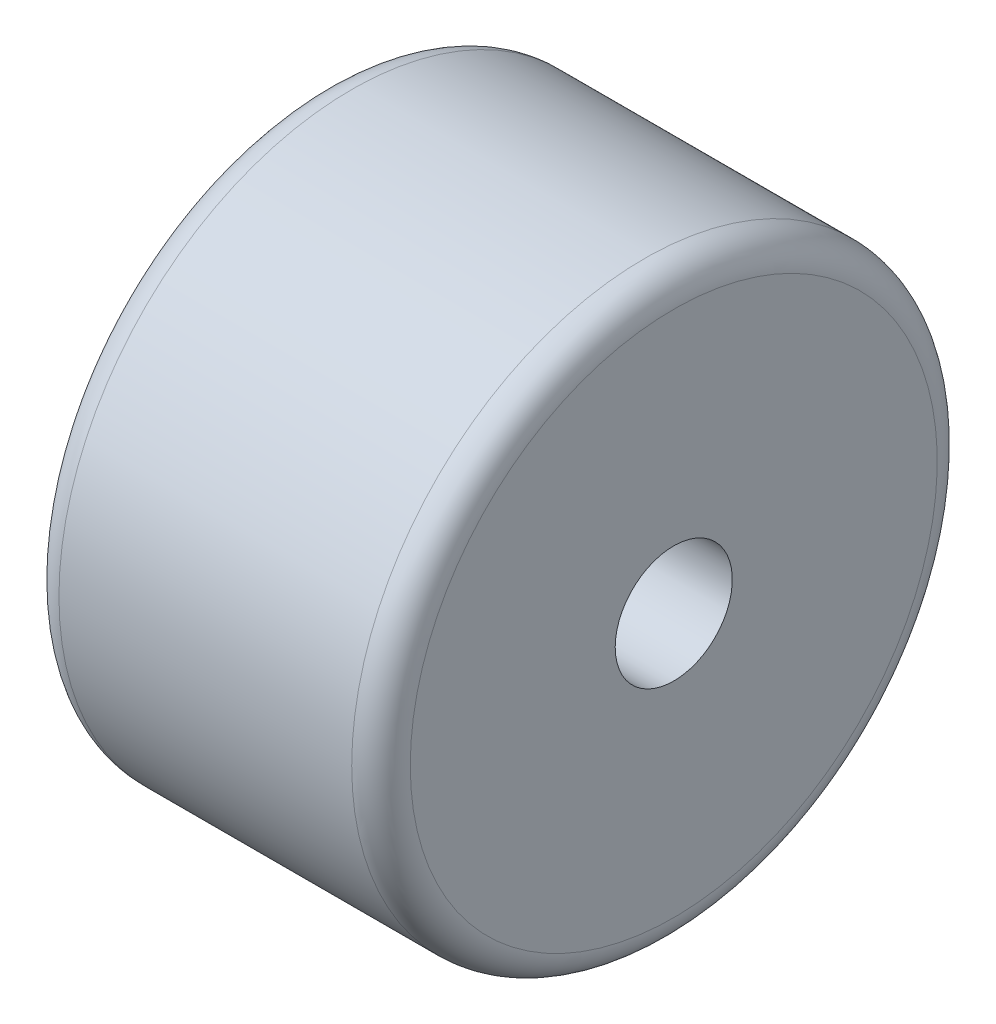
ISO-10303-21;
HEADER;
FILE_DESCRIPTION(('STEP AP214'),'2;1');
FILE_NAME('part.step','',(''),(''),'','','');
FILE_SCHEMA(('AUTOMOTIVE_DESIGN { 1 0 10303 214 1 1 1 1 }'));
ENDSEC;
DATA;
#1=APPLICATION_CONTEXT('core data for automotive mechanical design processes');
#2=APPLICATION_PROTOCOL_DEFINITION('international standard','automotive_design',2000,#1);
#3=PRODUCT_CONTEXT('',#1,'mechanical');
#4=PRODUCT('Part','Part','',(#3));
#5=PRODUCT_RELATED_PRODUCT_CATEGORY('part','',(#4));
#6=PRODUCT_DEFINITION_FORMATION('','',#4);
#7=PRODUCT_DEFINITION_CONTEXT('part definition',#1,'design');
#8=PRODUCT_DEFINITION('design','',#6,#7);
#9=PRODUCT_DEFINITION_SHAPE('','',#8);
#10=(LENGTH_UNIT() NAMED_UNIT(*) SI_UNIT(.MILLI.,.METRE.));
#11=(NAMED_UNIT(*) PLANE_ANGLE_UNIT() SI_UNIT($,.RADIAN.));
#12=(NAMED_UNIT(*) SI_UNIT($,.STERADIAN.) SOLID_ANGLE_UNIT());
#13=UNCERTAINTY_MEASURE_WITH_UNIT(LENGTH_MEASURE(1.E-05),#10,'distance_accuracy_value','');
#14=(GEOMETRIC_REPRESENTATION_CONTEXT(3) GLOBAL_UNCERTAINTY_ASSIGNED_CONTEXT((#13)) GLOBAL_UNIT_ASSIGNED_CONTEXT((#10,
#11,#12)) REPRESENTATION_CONTEXT('',''));
#15=CARTESIAN_POINT('',(0.,0.,0.));
#16=DIRECTION('',(0.,0.,1.));
#17=DIRECTION('',(1.,0.,0.));
#18=AXIS2_PLACEMENT_3D('',#15,#16,#17);
#19=CARTESIAN_POINT('',(0.,0.,0.));
#20=DIRECTION('',(-1.,0.,0.));
#21=DIRECTION('',(0.,0.,1.));
#22=AXIS2_PLACEMENT_3D('',#19,#20,#21);
#23=CYLINDRICAL_SURFACE('',#22,10.);
#24=CARTESIAN_POINT('',(1.,0.,0.));
#25=DIRECTION('',(-1.,0.,0.));
#26=DIRECTION('',(0.,0.,1.));
#27=AXIS2_PLACEMENT_3D('',#24,#25,#26);
#28=CIRCLE('',#27,10.);
#29=CARTESIAN_POINT('',(1.,0.,10.));
#30=VERTEX_POINT('',#29);
#31=EDGE_CURVE('E10',#30,#30,#28,.T.);
#32=ORIENTED_EDGE('',*,*,#31,.F.);
#33=EDGE_LOOP('',(#32));
#34=FACE_BOUND('',#33,.T.);
#35=CARTESIAN_POINT('',(11.,0.,0.));
#36=DIRECTION('',(-1.,0.,0.));
#37=DIRECTION('',(0.,0.,1.));
#38=AXIS2_PLACEMENT_3D('',#35,#36,#37);
#39=CIRCLE('',#38,10.);
#40=CARTESIAN_POINT('',(11.,0.,10.));
#41=VERTEX_POINT('',#40);
#42=EDGE_CURVE('E61',#41,#41,#39,.T.);
#43=ORIENTED_EDGE('',*,*,#42,.T.);
#44=EDGE_LOOP('',(#43));
#45=FACE_BOUND('',#44,.T.);
#46=ADVANCED_FACE('F39',(#34,#45),#23,.T.);
#47=CARTESIAN_POINT('',(1.,0.,0.));
#48=DIRECTION('',(-1.,0.,0.));
#49=DIRECTION('',(0.,0.,1.));
#50=AXIS2_PLACEMENT_3D('',#47,#48,#49);
#51=TOROIDAL_SURFACE('',#50,9.,1.);
#52=CARTESIAN_POINT('',(0.,0.,0.));
#53=DIRECTION('',(-1.,0.,0.));
#54=DIRECTION('',(0.,0.,1.));
#55=AXIS2_PLACEMENT_3D('',#52,#53,#54);
#56=CIRCLE('',#55,9.);
#57=CARTESIAN_POINT('',(0.,0.,9.));
#58=VERTEX_POINT('',#57);
#59=EDGE_CURVE('E45',#58,#58,#56,.T.);
#60=ORIENTED_EDGE('',*,*,#59,.F.);
#61=EDGE_LOOP('',(#60));
#62=FACE_BOUND('',#61,.T.);
#63=ORIENTED_EDGE('',*,*,#31,.T.);
#64=EDGE_LOOP('',(#63));
#65=FACE_BOUND('',#64,.T.);
#66=ADVANCED_FACE('F86',(#62,#65),#51,.T.);
#67=CARTESIAN_POINT('',(0.,0.,0.));
#68=DIRECTION('',(1.,0.,0.));
#69=DIRECTION('',(0.,0.,-1.));
#70=AXIS2_PLACEMENT_3D('',#67,#68,#69);
#71=PLANE('',#70);
#72=CARTESIAN_POINT('',(0.,0.,0.));
#73=DIRECTION('',(-1.,0.,0.));
#74=DIRECTION('',(0.,0.,1.));
#75=AXIS2_PLACEMENT_3D('',#72,#73,#74);
#76=CIRCLE('',#75,2.);
#77=CARTESIAN_POINT('',(0.,0.,2.));
#78=VERTEX_POINT('',#77);
#79=EDGE_CURVE('E49',#78,#78,#76,.T.);
#80=ORIENTED_EDGE('',*,*,#79,.F.);
#81=EDGE_LOOP('',(#80));
#82=FACE_BOUND('',#81,.T.);
#83=ORIENTED_EDGE('',*,*,#59,.T.);
#84=EDGE_LOOP('',(#83));
#85=FACE_BOUND('',#84,.T.);
#86=ADVANCED_FACE('F81',(#82,#85),#71,.F.);
#87=CARTESIAN_POINT('',(0.,0.,0.));
#88=DIRECTION('',(-1.,0.,0.));
#89=DIRECTION('',(0.,0.,1.));
#90=AXIS2_PLACEMENT_3D('',#87,#88,#89);
#91=CYLINDRICAL_SURFACE('',#90,2.);
#92=CARTESIAN_POINT('',(12.,0.,0.));
#93=DIRECTION('',(-1.,0.,0.));
#94=DIRECTION('',(0.,0.,1.));
#95=AXIS2_PLACEMENT_3D('',#92,#93,#94);
#96=CIRCLE('',#95,2.);
#97=CARTESIAN_POINT('',(12.,0.,2.));
#98=VERTEX_POINT('',#97);
#99=EDGE_CURVE('E53',#98,#98,#96,.T.);
#100=ORIENTED_EDGE('',*,*,#99,.F.);
#101=EDGE_LOOP('',(#100));
#102=FACE_BOUND('',#101,.T.);
#103=ORIENTED_EDGE('',*,*,#79,.T.);
#104=EDGE_LOOP('',(#103));
#105=FACE_BOUND('',#104,.T.);
#106=ADVANCED_FACE('F75',(#102,#105),#91,.F.);
#107=CARTESIAN_POINT('',(12.,0.,0.));
#108=DIRECTION('',(-1.,0.,0.));
#109=DIRECTION('',(0.,0.,1.));
#110=AXIS2_PLACEMENT_3D('',#107,#108,#109);
#111=PLANE('',#110);
#112=CARTESIAN_POINT('',(12.,0.,0.));
#113=DIRECTION('',(-1.,0.,0.));
#114=DIRECTION('',(0.,0.,1.));
#115=AXIS2_PLACEMENT_3D('',#112,#113,#114);
#116=CIRCLE('',#115,9.);
#117=CARTESIAN_POINT('',(12.,0.,9.));
#118=VERTEX_POINT('',#117);
#119=EDGE_CURVE('E58',#118,#118,#116,.T.);
#120=ORIENTED_EDGE('',*,*,#119,.F.);
#121=EDGE_LOOP('',(#120));
#122=FACE_BOUND('',#121,.T.);
#123=ORIENTED_EDGE('',*,*,#99,.T.);
#124=EDGE_LOOP('',(#123));
#125=FACE_BOUND('',#124,.T.);
#126=ADVANCED_FACE('F69',(#122,#125),#111,.F.);
#127=CARTESIAN_POINT('',(11.,0.,0.));
#128=DIRECTION('',(-1.,0.,0.));
#129=DIRECTION('',(0.,0.,1.));
#130=AXIS2_PLACEMENT_3D('',#127,#128,#129);
#131=TOROIDAL_SURFACE('',#130,9.,1.);
#132=ORIENTED_EDGE('',*,*,#42,.F.);
#133=EDGE_LOOP('',(#132));
#134=FACE_BOUND('',#133,.T.);
#135=ORIENTED_EDGE('',*,*,#119,.T.);
#136=EDGE_LOOP('',(#135));
#137=FACE_BOUND('',#136,.T.);
#138=ADVANCED_FACE('F66',(#134,#137),#131,.T.);
#139=CLOSED_SHELL('',(#46,#66,#86,#106,#126,#138));
#140=MANIFOLD_SOLID_BREP('B2',#139);
#141=ADVANCED_BREP_SHAPE_REPRESENTATION('',(#18,#140),#14);
#142=SHAPE_DEFINITION_REPRESENTATION(#9,#141);
ENDSEC;
END-ISO-10303-21;
